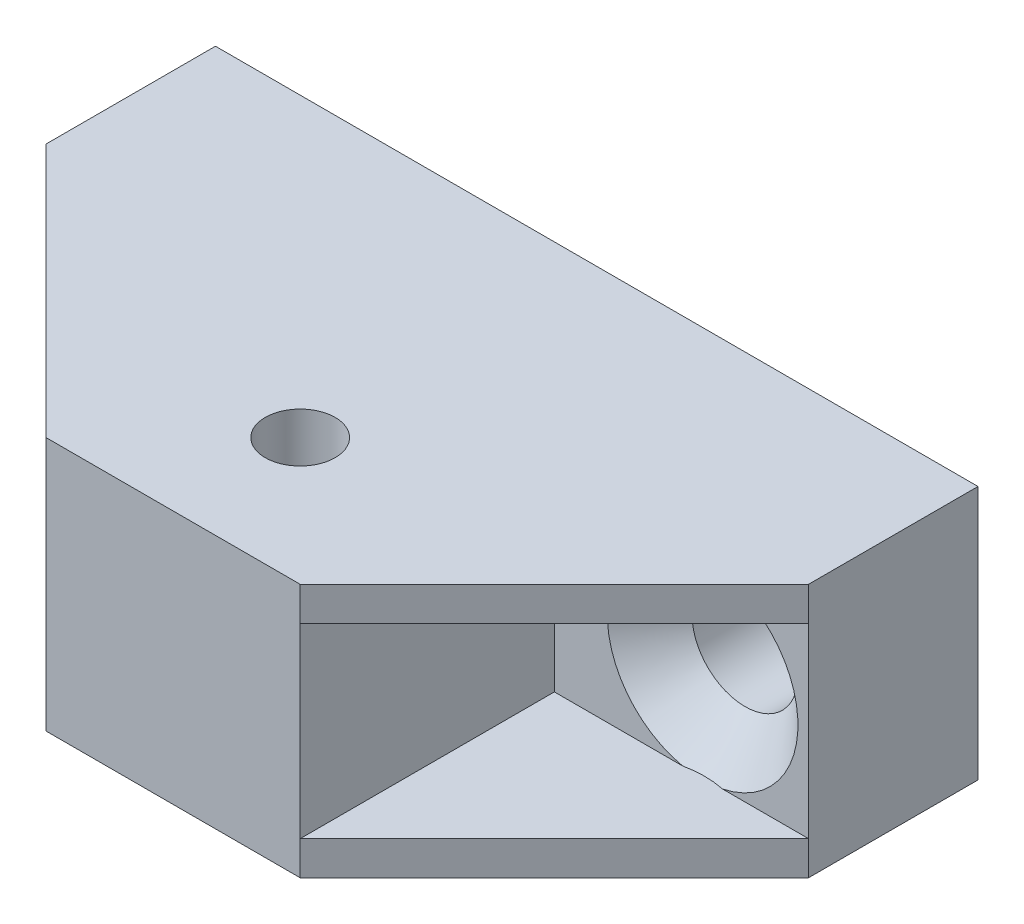
ISO-10303-21;
HEADER;
FILE_DESCRIPTION(('STEP AP214'),'2;1');
FILE_NAME('part.step','',(''),(''),'','','');
FILE_SCHEMA(('AUTOMOTIVE_DESIGN { 1 0 10303 214 1 1 1 1 }'));
ENDSEC;
DATA;
#1=APPLICATION_CONTEXT('core data for automotive mechanical design processes');
#2=APPLICATION_PROTOCOL_DEFINITION('international standard','automotive_design',2000,#1);
#3=PRODUCT_CONTEXT('',#1,'mechanical');
#4=PRODUCT('Part','Part','',(#3));
#5=PRODUCT_RELATED_PRODUCT_CATEGORY('part','',(#4));
#6=PRODUCT_DEFINITION_FORMATION('','',#4);
#7=PRODUCT_DEFINITION_CONTEXT('part definition',#1,'design');
#8=PRODUCT_DEFINITION('design','',#6,#7);
#9=PRODUCT_DEFINITION_SHAPE('','',#8);
#10=(LENGTH_UNIT() NAMED_UNIT(*) SI_UNIT(.MILLI.,.METRE.));
#11=(NAMED_UNIT(*) PLANE_ANGLE_UNIT() SI_UNIT($,.RADIAN.));
#12=(NAMED_UNIT(*) SI_UNIT($,.STERADIAN.) SOLID_ANGLE_UNIT());
#13=UNCERTAINTY_MEASURE_WITH_UNIT(LENGTH_MEASURE(1.E-05),#10,'distance_accuracy_value','');
#14=(GEOMETRIC_REPRESENTATION_CONTEXT(3) GLOBAL_UNCERTAINTY_ASSIGNED_CONTEXT((#13)) GLOBAL_UNIT_ASSIGNED_CONTEXT((#10,
#11,#12)) REPRESENTATION_CONTEXT('',''));
#15=CARTESIAN_POINT('',(0.,0.,0.));
#16=DIRECTION('',(0.,0.,1.));
#17=DIRECTION('',(1.,0.,0.));
#18=AXIS2_PLACEMENT_3D('',#15,#16,#17);
#19=CARTESIAN_POINT('',(0.,0.,8.));
#20=DIRECTION('',(0.,0.,-1.));
#21=DIRECTION('',(-1.,0.,0.));
#22=AXIS2_PLACEMENT_3D('',#19,#20,#21);
#23=PLANE('',#22);
#24=DIRECTION('',(1.,0.,0.));
#25=VECTOR('',#24,1.);
#26=CARTESIAN_POINT('',(12.,1.6,8.));
#27=LINE('',#26,#25);
#28=CARTESIAN_POINT('',(0.,1.6,8.));
#29=VERTEX_POINT('',#28);
#30=CARTESIAN_POINT('',(4.05660188679435,1.6,8.));
#31=VERTEX_POINT('',#30);
#32=EDGE_CURVE('E340',#29,#31,#27,.T.);
#33=ORIENTED_EDGE('',*,*,#32,.T.);
#34=CARTESIAN_POINT('',(5.,6.,8.));
#35=DIRECTION('',(0.,0.,-1.));
#36=DIRECTION('',(-1.,0.,0.));
#37=AXIS2_PLACEMENT_3D('',#34,#35,#36);
#38=CIRCLE('',#37,4.5);
#39=CARTESIAN_POINT('',(4.05660188679435,10.4,8.));
#40=VERTEX_POINT('',#39);
#41=EDGE_CURVE('E248',#31,#40,#38,.T.);
#42=ORIENTED_EDGE('',*,*,#41,.T.);
#43=DIRECTION('',(1.,0.,0.));
#44=VECTOR('',#43,1.);
#45=CARTESIAN_POINT('',(12.,10.4,8.));
#46=LINE('',#45,#44);
#47=CARTESIAN_POINT('',(0.,10.4,8.));
#48=VERTEX_POINT('',#47);
#49=EDGE_CURVE('E319',#48,#40,#46,.T.);
#50=ORIENTED_EDGE('',*,*,#49,.F.);
#51=DIRECTION('',(0.,-1.,0.));
#52=VECTOR('',#51,1.);
#53=CARTESIAN_POINT('',(0.,0.,8.));
#54=LINE('',#53,#52);
#55=EDGE_CURVE('E210',#48,#29,#54,.T.);
#56=ORIENTED_EDGE('',*,*,#55,.T.);
#57=EDGE_LOOP('',(#33,#42,#50,#56));
#58=FACE_BOUND('',#57,.T.);
#59=ADVANCED_FACE('F35',(#58),#23,.F.);
#60=DIRECTION('',(1.,0.,0.));
#61=VECTOR('',#60,1.);
#62=CARTESIAN_POINT('',(24.,1.6,8.));
#63=LINE('',#62,#61);
#64=CARTESIAN_POINT('',(24.,1.6,8.));
#65=VERTEX_POINT('',#64);
#66=CARTESIAN_POINT('',(30.0566018867944,1.6,8.));
#67=VERTEX_POINT('',#66);
#68=EDGE_CURVE('E294',#65,#67,#63,.T.);
#69=ORIENTED_EDGE('',*,*,#68,.T.);
#70=CARTESIAN_POINT('',(31.,6.,8.));
#71=DIRECTION('',(0.,0.,-1.));
#72=DIRECTION('',(-1.,0.,0.));
#73=AXIS2_PLACEMENT_3D('',#70,#71,#72);
#74=CIRCLE('',#73,4.49999999999998);
#75=CARTESIAN_POINT('',(30.0566018867944,10.4,8.));
#76=VERTEX_POINT('',#75);
#77=EDGE_CURVE('E241',#67,#76,#74,.T.);
#78=ORIENTED_EDGE('',*,*,#77,.T.);
#79=DIRECTION('',(1.,0.,0.));
#80=VECTOR('',#79,1.);
#81=CARTESIAN_POINT('',(24.,10.4,8.));
#82=LINE('',#81,#80);
#83=CARTESIAN_POINT('',(24.,10.4,8.));
#84=VERTEX_POINT('',#83);
#85=EDGE_CURVE('E303',#84,#76,#82,.T.);
#86=ORIENTED_EDGE('',*,*,#85,.F.);
#87=DIRECTION('',(0.,1.,0.));
#88=VECTOR('',#87,1.);
#89=CARTESIAN_POINT('',(24.,0.,8.));
#90=LINE('',#89,#88);
#91=EDGE_CURVE('E185',#65,#84,#90,.T.);
#92=ORIENTED_EDGE('',*,*,#91,.F.);
#93=EDGE_LOOP('',(#69,#78,#86,#92));
#94=FACE_BOUND('',#93,.T.);
#95=ADVANCED_FACE('F300',(#94),#23,.F.);
#96=CARTESIAN_POINT('',(5.94339811320565,10.4,8.));
#97=VERTEX_POINT('',#96);
#98=CARTESIAN_POINT('',(12.,10.4,8.));
#99=VERTEX_POINT('',#98);
#100=EDGE_CURVE('E318',#97,#99,#46,.T.);
#101=ORIENTED_EDGE('',*,*,#100,.F.);
#102=CARTESIAN_POINT('',(5.,6.,8.));
#103=DIRECTION('',(0.,0.,-1.));
#104=DIRECTION('',(-1.,0.,0.));
#105=AXIS2_PLACEMENT_3D('',#102,#103,#104);
#106=CIRCLE('',#105,4.5);
#107=CARTESIAN_POINT('',(5.94339811320565,1.6,8.));
#108=VERTEX_POINT('',#107);
#109=EDGE_CURVE('E57',#97,#108,#106,.T.);
#110=ORIENTED_EDGE('',*,*,#109,.T.);
#111=CARTESIAN_POINT('',(12.,1.6,8.));
#112=VERTEX_POINT('',#111);
#113=EDGE_CURVE('E339',#108,#112,#27,.T.);
#114=ORIENTED_EDGE('',*,*,#113,.T.);
#115=DIRECTION('',(0.,1.,0.));
#116=VECTOR('',#115,1.);
#117=CARTESIAN_POINT('',(12.,0.,8.));
#118=LINE('',#117,#116);
#119=EDGE_CURVE('E205',#112,#99,#118,.T.);
#120=ORIENTED_EDGE('',*,*,#119,.T.);
#121=EDGE_LOOP('',(#101,#110,#114,#120));
#122=FACE_BOUND('',#121,.T.);
#123=ADVANCED_FACE('F353',(#122),#23,.F.);
#124=CARTESIAN_POINT('',(12.,0.,8.));
#125=DIRECTION('',(-1.,0.,0.));
#126=DIRECTION('',(0.,0.,1.));
#127=AXIS2_PLACEMENT_3D('',#124,#125,#126);
#128=PLANE('',#127);
#129=DIRECTION('',(0.,1.,0.));
#130=VECTOR('',#129,1.);
#131=CARTESIAN_POINT('',(12.,0.,20.));
#132=LINE('',#131,#130);
#133=CARTESIAN_POINT('',(12.,1.6,20.));
#134=VERTEX_POINT('',#133);
#135=CARTESIAN_POINT('',(12.,10.4,20.));
#136=VERTEX_POINT('',#135);
#137=EDGE_CURVE('E193',#134,#136,#132,.T.);
#138=ORIENTED_EDGE('',*,*,#137,.T.);
#139=DIRECTION('',(0.,0.,1.));
#140=VECTOR('',#139,1.);
#141=CARTESIAN_POINT('',(12.,10.4,20.));
#142=LINE('',#141,#140);
#143=EDGE_CURVE('E312',#99,#136,#142,.T.);
#144=ORIENTED_EDGE('',*,*,#143,.F.);
#145=ORIENTED_EDGE('',*,*,#119,.F.);
#146=DIRECTION('',(0.,0.,1.));
#147=VECTOR('',#146,1.);
#148=CARTESIAN_POINT('',(12.,1.6,20.));
#149=LINE('',#148,#147);
#150=EDGE_CURVE('E333',#112,#134,#149,.T.);
#151=ORIENTED_EDGE('',*,*,#150,.T.);
#152=EDGE_LOOP('',(#138,#144,#145,#151));
#153=FACE_BOUND('',#152,.T.);
#154=ADVANCED_FACE('F358',(#153),#128,.T.);
#155=CARTESIAN_POINT('',(31.9433981132056,10.4,8.));
#156=VERTEX_POINT('',#155);
#157=CARTESIAN_POINT('',(36.,10.4,8.));
#158=VERTEX_POINT('',#157);
#159=EDGE_CURVE('E162',#156,#158,#82,.T.);
#160=ORIENTED_EDGE('',*,*,#159,.F.);
#161=CARTESIAN_POINT('',(31.,6.,8.));
#162=DIRECTION('',(0.,0.,-1.));
#163=DIRECTION('',(-1.,0.,0.));
#164=AXIS2_PLACEMENT_3D('',#161,#162,#163);
#165=CIRCLE('',#164,4.49999999999998);
#166=CARTESIAN_POINT('',(31.9433981132056,1.6,8.));
#167=VERTEX_POINT('',#166);
#168=EDGE_CURVE('E234',#156,#167,#165,.T.);
#169=ORIENTED_EDGE('',*,*,#168,.T.);
#170=CARTESIAN_POINT('',(36.,1.6,8.));
#171=VERTEX_POINT('',#170);
#172=EDGE_CURVE('E295',#167,#171,#63,.T.);
#173=ORIENTED_EDGE('',*,*,#172,.T.);
#174=DIRECTION('',(0.,1.,0.));
#175=VECTOR('',#174,1.);
#176=CARTESIAN_POINT('',(36.,0.,8.));
#177=LINE('',#176,#175);
#178=EDGE_CURVE('E209',#171,#158,#177,.T.);
#179=ORIENTED_EDGE('',*,*,#178,.T.);
#180=EDGE_LOOP('',(#160,#169,#173,#179));
#181=FACE_BOUND('',#180,.T.);
#182=ADVANCED_FACE('F306',(#181),#23,.F.);
#183=CARTESIAN_POINT('',(24.,0.,8.));
#184=DIRECTION('',(1.,0.,0.));
#185=DIRECTION('',(0.,0.,-1.));
#186=AXIS2_PLACEMENT_3D('',#183,#184,#185);
#187=PLANE('',#186);
#188=DIRECTION('',(0.,0.,-1.));
#189=VECTOR('',#188,1.);
#190=CARTESIAN_POINT('',(24.,10.4,20.));
#191=LINE('',#190,#189);
#192=CARTESIAN_POINT('',(24.,10.4,20.));
#193=VERTEX_POINT('',#192);
#194=EDGE_CURVE('E159',#193,#84,#191,.T.);
#195=ORIENTED_EDGE('',*,*,#194,.F.);
#196=DIRECTION('',(0.,1.,0.));
#197=VECTOR('',#196,1.);
#198=CARTESIAN_POINT('',(24.,0.,20.));
#199=LINE('',#198,#197);
#200=CARTESIAN_POINT('',(24.,1.6,20.));
#201=VERTEX_POINT('',#200);
#202=EDGE_CURVE('E182',#201,#193,#199,.T.);
#203=ORIENTED_EDGE('',*,*,#202,.F.);
#204=DIRECTION('',(0.,0.,-1.));
#205=VECTOR('',#204,1.);
#206=CARTESIAN_POINT('',(24.,1.6,20.));
#207=LINE('',#206,#205);
#208=EDGE_CURVE('E329',#201,#65,#207,.T.);
#209=ORIENTED_EDGE('',*,*,#208,.T.);
#210=ORIENTED_EDGE('',*,*,#91,.T.);
#211=EDGE_LOOP('',(#195,#203,#209,#210));
#212=FACE_BOUND('',#211,.T.);
#213=ADVANCED_FACE('F180',(#212),#187,.T.);
#214=CARTESIAN_POINT('',(0.,0.,8.));
#215=DIRECTION('',(1.,0.,0.));
#216=DIRECTION('',(0.,0.,-1.));
#217=AXIS2_PLACEMENT_3D('',#214,#215,#216);
#218=PLANE('',#217);
#219=DIRECTION('',(0.,-1.,0.));
#220=VECTOR('',#219,1.);
#221=CARTESIAN_POINT('',(0.,0.,0.));
#222=LINE('',#221,#220);
#223=CARTESIAN_POINT('',(0.,12.,0.));
#224=VERTEX_POINT('',#223);
#225=CARTESIAN_POINT('',(0.,0.,0.));
#226=VERTEX_POINT('',#225);
#227=EDGE_CURVE('E201',#224,#226,#222,.T.);
#228=ORIENTED_EDGE('',*,*,#227,.T.);
#229=DIRECTION('',(0.,0.,-1.));
#230=VECTOR('',#229,1.);
#231=CARTESIAN_POINT('',(0.,0.,8.));
#232=LINE('',#231,#230);
#233=CARTESIAN_POINT('',(0.,0.,8.));
#234=VERTEX_POINT('',#233);
#235=EDGE_CURVE('E231',#234,#226,#232,.T.);
#236=ORIENTED_EDGE('',*,*,#235,.F.);
#237=DIRECTION('',(0.,-1.,0.));
#238=VECTOR('',#237,1.);
#239=CARTESIAN_POINT('',(0.,1.6,8.));
#240=LINE('',#239,#238);
#241=EDGE_CURVE('E342',#29,#234,#240,.T.);
#242=ORIENTED_EDGE('',*,*,#241,.F.);
#243=ORIENTED_EDGE('',*,*,#55,.F.);
#244=CARTESIAN_POINT('',(0.,12.,8.));
#245=VERTEX_POINT('',#244);
#246=EDGE_CURVE('E206',#245,#48,#54,.T.);
#247=ORIENTED_EDGE('',*,*,#246,.F.);
#248=DIRECTION('',(0.,0.,-1.));
#249=VECTOR('',#248,1.);
#250=CARTESIAN_POINT('',(0.,12.,8.));
#251=LINE('',#250,#249);
#252=EDGE_CURVE('E214',#245,#224,#251,.T.);
#253=ORIENTED_EDGE('',*,*,#252,.T.);
#254=EDGE_LOOP('',(#228,#236,#242,#243,#247,#253));
#255=FACE_BOUND('',#254,.T.);
#256=ADVANCED_FACE('F388',(#255),#218,.F.);
#257=CARTESIAN_POINT('',(0.,0.,8.));
#258=DIRECTION('',(0.,1.,0.));
#259=DIRECTION('',(0.,0.,1.));
#260=AXIS2_PLACEMENT_3D('',#257,#258,#259);
#261=PLANE('',#260);
#262=DIRECTION('',(0.,0.,-1.));
#263=VECTOR('',#262,1.);
#264=CARTESIAN_POINT('',(36.,0.,8.));
#265=LINE('',#264,#263);
#266=CARTESIAN_POINT('',(36.,0.,8.));
#267=VERTEX_POINT('',#266);
#268=CARTESIAN_POINT('',(36.,0.,0.));
#269=VERTEX_POINT('',#268);
#270=EDGE_CURVE('E228',#267,#269,#265,.T.);
#271=ORIENTED_EDGE('',*,*,#270,.F.);
#272=DIRECTION('',(-0.707106781186547,0.,0.707106781186548));
#273=VECTOR('',#272,1.);
#274=CARTESIAN_POINT('',(36.,0.,8.));
#275=LINE('',#274,#273);
#276=CARTESIAN_POINT('',(24.,0.,20.));
#277=VERTEX_POINT('',#276);
#278=EDGE_CURVE('E326',#267,#277,#275,.T.);
#279=ORIENTED_EDGE('',*,*,#278,.T.);
#280=DIRECTION('',(1.,0.,0.));
#281=VECTOR('',#280,1.);
#282=CARTESIAN_POINT('',(12.,0.,20.));
#283=LINE('',#282,#281);
#284=CARTESIAN_POINT('',(12.,0.,20.));
#285=VERTEX_POINT('',#284);
#286=EDGE_CURVE('E349',#285,#277,#283,.T.);
#287=ORIENTED_EDGE('',*,*,#286,.F.);
#288=DIRECTION('',(-0.707106781186547,0.,-0.707106781186548));
#289=VECTOR('',#288,1.);
#290=CARTESIAN_POINT('',(0.,0.,8.));
#291=LINE('',#290,#289);
#292=EDGE_CURVE('E301',#285,#234,#291,.T.);
#293=ORIENTED_EDGE('',*,*,#292,.T.);
#294=ORIENTED_EDGE('',*,*,#235,.T.);
#295=DIRECTION('',(1.,0.,0.));
#296=VECTOR('',#295,1.);
#297=CARTESIAN_POINT('',(0.,0.,0.));
#298=LINE('',#297,#296);
#299=EDGE_CURVE('E217',#226,#269,#298,.T.);
#300=ORIENTED_EDGE('',*,*,#299,.T.);
#301=EDGE_LOOP('',(#271,#279,#287,#293,#294,#300));
#302=FACE_BOUND('',#301,.T.);
#303=CARTESIAN_POINT('',(18.,0.,14.));
#304=DIRECTION('',(0.,1.,0.));
#305=DIRECTION('',(0.,0.,1.));
#306=AXIS2_PLACEMENT_3D('',#303,#304,#305);
#307=CIRCLE('',#306,1.65);
#308=CARTESIAN_POINT('',(18.,0.,15.65));
#309=VERTEX_POINT('',#308);
#310=EDGE_CURVE('E239',#309,#309,#307,.T.);
#311=ORIENTED_EDGE('',*,*,#310,.T.);
#312=EDGE_LOOP('',(#311));
#313=FACE_BOUND('',#312,.T.);
#314=ADVANCED_FACE('F368',(#302,#313),#261,.F.);
#315=CARTESIAN_POINT('',(36.,0.,8.));
#316=DIRECTION('',(-1.,0.,0.));
#317=DIRECTION('',(0.,0.,1.));
#318=AXIS2_PLACEMENT_3D('',#315,#316,#317);
#319=PLANE('',#318);
#320=DIRECTION('',(0.,1.,0.));
#321=VECTOR('',#320,1.);
#322=CARTESIAN_POINT('',(36.,0.,0.));
#323=LINE('',#322,#321);
#324=CARTESIAN_POINT('',(36.,12.,0.));
#325=VERTEX_POINT('',#324);
#326=EDGE_CURVE('E219',#269,#325,#323,.T.);
#327=ORIENTED_EDGE('',*,*,#326,.T.);
#328=DIRECTION('',(0.,0.,-1.));
#329=VECTOR('',#328,1.);
#330=CARTESIAN_POINT('',(36.,12.,8.));
#331=LINE('',#330,#329);
#332=CARTESIAN_POINT('',(36.,12.,8.));
#333=VERTEX_POINT('',#332);
#334=EDGE_CURVE('E225',#333,#325,#331,.T.);
#335=ORIENTED_EDGE('',*,*,#334,.F.);
#336=DIRECTION('',(0.,1.,0.));
#337=VECTOR('',#336,1.);
#338=CARTESIAN_POINT('',(36.,10.4,8.));
#339=LINE('',#338,#337);
#340=EDGE_CURVE('E175',#158,#333,#339,.T.);
#341=ORIENTED_EDGE('',*,*,#340,.F.);
#342=ORIENTED_EDGE('',*,*,#178,.F.);
#343=EDGE_CURVE('E211',#267,#171,#177,.T.);
#344=ORIENTED_EDGE('',*,*,#343,.F.);
#345=ORIENTED_EDGE('',*,*,#270,.T.);
#346=EDGE_LOOP('',(#327,#335,#341,#342,#344,#345));
#347=FACE_BOUND('',#346,.T.);
#348=ADVANCED_FACE('F374',(#347),#319,.F.);
#349=CARTESIAN_POINT('',(0.,12.,8.));
#350=DIRECTION('',(0.,-1.,0.));
#351=DIRECTION('',(0.,0.,-1.));
#352=AXIS2_PLACEMENT_3D('',#349,#350,#351);
#353=PLANE('',#352);
#354=ORIENTED_EDGE('',*,*,#252,.F.);
#355=DIRECTION('',(-0.707106781186547,0.,-0.707106781186548));
#356=VECTOR('',#355,1.);
#357=CARTESIAN_POINT('',(0.,12.,8.));
#358=LINE('',#357,#356);
#359=CARTESIAN_POINT('',(12.,12.,20.));
#360=VERTEX_POINT('',#359);
#361=EDGE_CURVE('E174',#360,#245,#358,.T.);
#362=ORIENTED_EDGE('',*,*,#361,.F.);
#363=DIRECTION('',(1.,0.,0.));
#364=VECTOR('',#363,1.);
#365=CARTESIAN_POINT('',(12.,12.,20.));
#366=LINE('',#365,#364);
#367=CARTESIAN_POINT('',(24.,12.,20.));
#368=VERTEX_POINT('',#367);
#369=EDGE_CURVE('E238',#360,#368,#366,.T.);
#370=ORIENTED_EDGE('',*,*,#369,.T.);
#371=DIRECTION('',(-0.707106781186547,0.,0.707106781186548));
#372=VECTOR('',#371,1.);
#373=CARTESIAN_POINT('',(36.,12.,8.));
#374=LINE('',#373,#372);
#375=EDGE_CURVE('E165',#333,#368,#374,.T.);
#376=ORIENTED_EDGE('',*,*,#375,.F.);
#377=ORIENTED_EDGE('',*,*,#334,.T.);
#378=DIRECTION('',(-1.,0.,0.));
#379=VECTOR('',#378,1.);
#380=CARTESIAN_POINT('',(0.,12.,0.));
#381=LINE('',#380,#379);
#382=EDGE_CURVE('E221',#325,#224,#381,.T.);
#383=ORIENTED_EDGE('',*,*,#382,.T.);
#384=EDGE_LOOP('',(#354,#362,#370,#376,#377,#383));
#385=FACE_BOUND('',#384,.T.);
#386=CARTESIAN_POINT('',(18.,12.,14.));
#387=DIRECTION('',(0.,-1.,0.));
#388=DIRECTION('',(0.,0.,-1.));
#389=AXIS2_PLACEMENT_3D('',#386,#387,#388);
#390=CIRCLE('',#389,1.65);
#391=CARTESIAN_POINT('',(18.,12.,12.35));
#392=VERTEX_POINT('',#391);
#393=EDGE_CURVE('E235',#392,#392,#390,.T.);
#394=ORIENTED_EDGE('',*,*,#393,.T.);
#395=EDGE_LOOP('',(#394));
#396=FACE_BOUND('',#395,.T.);
#397=ADVANCED_FACE('F377',(#385,#396),#353,.F.);
#398=CARTESIAN_POINT('',(0.,0.,0.));
#399=DIRECTION('',(0.,0.,-1.));
#400=DIRECTION('',(-1.,0.,0.));
#401=AXIS2_PLACEMENT_3D('',#398,#399,#400);
#402=PLANE('',#401);
#403=CARTESIAN_POINT('',(5.,6.,0.));
#404=DIRECTION('',(0.,0.,1.));
#405=DIRECTION('',(1.,0.,0.));
#406=AXIS2_PLACEMENT_3D('',#403,#404,#405);
#407=CIRCLE('',#406,2.5);
#408=CARTESIAN_POINT('',(7.5,6.,0.));
#409=VERTEX_POINT('',#408);
#410=EDGE_CURVE('E198',#409,#409,#407,.T.);
#411=ORIENTED_EDGE('',*,*,#410,.T.);
#412=EDGE_LOOP('',(#411));
#413=FACE_BOUND('',#412,.T.);
#414=CARTESIAN_POINT('',(31.,6.,0.));
#415=DIRECTION('',(0.,0.,1.));
#416=DIRECTION('',(-1.,0.,0.));
#417=AXIS2_PLACEMENT_3D('',#414,#415,#416);
#418=CIRCLE('',#417,2.49999999999999);
#419=CARTESIAN_POINT('',(28.5,6.,0.));
#420=VERTEX_POINT('',#419);
#421=EDGE_CURVE('E202',#420,#420,#418,.T.);
#422=ORIENTED_EDGE('',*,*,#421,.T.);
#423=EDGE_LOOP('',(#422));
#424=FACE_BOUND('',#423,.T.);
#425=ORIENTED_EDGE('',*,*,#227,.F.);
#426=ORIENTED_EDGE('',*,*,#382,.F.);
#427=ORIENTED_EDGE('',*,*,#326,.F.);
#428=ORIENTED_EDGE('',*,*,#299,.F.);
#429=EDGE_LOOP('',(#425,#426,#427,#428));
#430=FACE_BOUND('',#429,.T.);
#431=ADVANCED_FACE('F392',(#413,#424,#430),#402,.T.);
#432=CARTESIAN_POINT('',(31.,6.,0.));
#433=DIRECTION('',(0.,0.,1.));
#434=DIRECTION('',(1.,0.,0.));
#435=AXIS2_PLACEMENT_3D('',#432,#433,#434);
#436=CYLINDRICAL_SURFACE('',#435,2.49999999999999);
#437=CARTESIAN_POINT('',(31.,6.,6.));
#438=DIRECTION('',(0.,0.,-1.));
#439=DIRECTION('',(-1.,0.,0.));
#440=AXIS2_PLACEMENT_3D('',#437,#438,#439);
#441=CIRCLE('',#440,2.49999999999999);
#442=CARTESIAN_POINT('',(28.5,6.,6.));
#443=VERTEX_POINT('',#442);
#444=EDGE_CURVE('E244',#443,#443,#441,.F.);
#445=ORIENTED_EDGE('',*,*,#444,.T.);
#446=EDGE_LOOP('',(#445));
#447=FACE_BOUND('',#446,.T.);
#448=ORIENTED_EDGE('',*,*,#421,.F.);
#449=EDGE_LOOP('',(#448));
#450=FACE_BOUND('',#449,.T.);
#451=ADVANCED_FACE('F394',(#447,#450),#436,.F.);
#452=CARTESIAN_POINT('',(5.,6.,0.));
#453=DIRECTION('',(0.,0.,1.));
#454=DIRECTION('',(1.,0.,0.));
#455=AXIS2_PLACEMENT_3D('',#452,#453,#454);
#456=CYLINDRICAL_SURFACE('',#455,2.5);
#457=CARTESIAN_POINT('',(5.,6.,5.99999999999999));
#458=DIRECTION('',(0.,0.,-1.));
#459=DIRECTION('',(-1.,0.,0.));
#460=AXIS2_PLACEMENT_3D('',#457,#458,#459);
#461=CIRCLE('',#460,2.5);
#462=CARTESIAN_POINT('',(2.5,6.,5.99999999999999));
#463=VERTEX_POINT('',#462);
#464=EDGE_CURVE('E251',#463,#463,#461,.F.);
#465=ORIENTED_EDGE('',*,*,#464,.T.);
#466=EDGE_LOOP('',(#465));
#467=FACE_BOUND('',#466,.T.);
#468=ORIENTED_EDGE('',*,*,#410,.F.);
#469=EDGE_LOOP('',(#468));
#470=FACE_BOUND('',#469,.T.);
#471=ADVANCED_FACE('F401',(#467,#470),#456,.F.);
#472=CARTESIAN_POINT('',(12.,0.,20.));
#473=DIRECTION('',(0.,0.,1.));
#474=DIRECTION('',(1.,0.,0.));
#475=AXIS2_PLACEMENT_3D('',#472,#473,#474);
#476=PLANE('',#475);
#477=ORIENTED_EDGE('',*,*,#369,.F.);
#478=DIRECTION('',(0.,1.,0.));
#479=VECTOR('',#478,1.);
#480=CARTESIAN_POINT('',(12.,10.4,20.));
#481=LINE('',#480,#479);
#482=EDGE_CURVE('E321',#136,#360,#481,.T.);
#483=ORIENTED_EDGE('',*,*,#482,.F.);
#484=ORIENTED_EDGE('',*,*,#137,.F.);
#485=EDGE_CURVE('E190',#285,#134,#132,.T.);
#486=ORIENTED_EDGE('',*,*,#485,.F.);
#487=ORIENTED_EDGE('',*,*,#286,.T.);
#488=EDGE_CURVE('E189',#277,#201,#199,.T.);
#489=ORIENTED_EDGE('',*,*,#488,.T.);
#490=ORIENTED_EDGE('',*,*,#202,.T.);
#491=DIRECTION('',(0.,1.,0.));
#492=VECTOR('',#491,1.);
#493=CARTESIAN_POINT('',(24.,10.4,20.));
#494=LINE('',#493,#492);
#495=EDGE_CURVE('E168',#193,#368,#494,.T.);
#496=ORIENTED_EDGE('',*,*,#495,.T.);
#497=EDGE_LOOP('',(#477,#483,#484,#486,#487,#489,#490,#496));
#498=FACE_BOUND('',#497,.T.);
#499=ADVANCED_FACE('F187',(#498),#476,.T.);
#500=CARTESIAN_POINT('',(18.,0.,14.));
#501=DIRECTION('',(0.,1.,0.));
#502=DIRECTION('',(0.,0.,1.));
#503=AXIS2_PLACEMENT_3D('',#500,#501,#502);
#504=CYLINDRICAL_SURFACE('',#503,1.65);
#505=ORIENTED_EDGE('',*,*,#310,.F.);
#506=EDGE_LOOP('',(#505));
#507=FACE_BOUND('',#506,.T.);
#508=ORIENTED_EDGE('',*,*,#393,.F.);
#509=EDGE_LOOP('',(#508));
#510=FACE_BOUND('',#509,.T.);
#511=ADVANCED_FACE('F426',(#507,#510),#504,.F.);
#512=CARTESIAN_POINT('',(0.,1.6,8.));
#513=DIRECTION('',(-0.707106781186548,0.,0.707106781186548));
#514=DIRECTION('',(0.707106781186548,0.,0.707106781186548));
#515=AXIS2_PLACEMENT_3D('',#512,#513,#514);
#516=PLANE('',#515);
#517=ORIENTED_EDGE('',*,*,#292,.F.);
#518=ORIENTED_EDGE('',*,*,#485,.T.);
#519=DIRECTION('',(-0.707106781186547,0.,-0.707106781186548));
#520=VECTOR('',#519,1.);
#521=CARTESIAN_POINT('',(0.,1.6,8.));
#522=LINE('',#521,#520);
#523=EDGE_CURVE('E336',#134,#29,#522,.T.);
#524=ORIENTED_EDGE('',*,*,#523,.T.);
#525=ORIENTED_EDGE('',*,*,#241,.T.);
#526=EDGE_LOOP('',(#517,#518,#524,#525));
#527=FACE_BOUND('',#526,.T.);
#528=ADVANCED_FACE('F363',(#527),#516,.T.);
#529=CARTESIAN_POINT('',(0.,1.6,0.));
#530=DIRECTION('',(0.,1.,0.));
#531=DIRECTION('',(0.,0.,1.));
#532=AXIS2_PLACEMENT_3D('',#529,#530,#531);
#533=PLANE('',#532);
#534=ORIENTED_EDGE('',*,*,#150,.F.);
#535=ORIENTED_EDGE('',*,*,#113,.F.);
#536=CARTESIAN_POINT('',(5.94339811320565,1.6,8.));
#537=CARTESIAN_POINT('',(5.83359450762683,1.6,7.97693232826158));
#538=CARTESIAN_POINT('',(5.72296487687723,1.6,7.95762656917826));
#539=CARTESIAN_POINT('',(5.50055280795741,1.6,7.92702286816681));
#540=CARTESIAN_POINT('',(5.38876982781334,1.6,7.91572888284725));
#541=CARTESIAN_POINT('',(5.16636862697427,1.6,7.90176376495504));
#542=CARTESIAN_POINT('',(5.05575864049396,1.6,7.89896375945088));
#543=CARTESIAN_POINT('',(4.83469390010924,1.6,7.90171806855617));
#544=CARTESIAN_POINT('',(4.72423909745673,1.6,7.90726842064796));
#545=CARTESIAN_POINT('',(4.52080330320934,1.6,7.92504057480302));
#546=CARTESIAN_POINT('',(4.42771937787119,1.6,7.93611949084911));
#547=CARTESIAN_POINT('',(4.24176475351793,1.6,7.96389576074271));
#548=CARTESIAN_POINT('',(4.14889948237872,1.6,7.98062958386276));
#549=CARTESIAN_POINT('',(4.05660188679435,1.6,8.));
#550=B_SPLINE_CURVE_WITH_KNOTS('',3,(#536,#537,#538,#539,#540,#541,#542,#543,#544,#545,#546,
#547,#548,#549),.UNSPECIFIED.,.F.,.F.,(4,2,2,2,2,2,4),(0.,0.336589383646868,0.673344876210967,
1.00496480746203,1.33642742384174,1.61748431608187,1.90038951649221),.UNSPECIFIED.);
#551=EDGE_CURVE('E11',#108,#31,#550,.T.);
#552=ORIENTED_EDGE('',*,*,#551,.T.);
#553=ORIENTED_EDGE('',*,*,#32,.F.);
#554=ORIENTED_EDGE('',*,*,#523,.F.);
#555=EDGE_LOOP('',(#534,#535,#552,#553,#554));
#556=FACE_BOUND('',#555,.T.);
#557=ADVANCED_FACE('F360',(#556),#533,.T.);
#558=CARTESIAN_POINT('',(36.,1.6,8.));
#559=DIRECTION('',(0.707106781186548,0.,0.707106781186547));
#560=DIRECTION('',(0.707106781186547,0.,-0.707106781186548));
#561=AXIS2_PLACEMENT_3D('',#558,#559,#560);
#562=PLANE('',#561);
#563=ORIENTED_EDGE('',*,*,#278,.F.);
#564=ORIENTED_EDGE('',*,*,#343,.T.);
#565=DIRECTION('',(-0.707106781186547,0.,0.707106781186548));
#566=VECTOR('',#565,1.);
#567=CARTESIAN_POINT('',(36.,1.6,8.));
#568=LINE('',#567,#566);
#569=EDGE_CURVE('E327',#171,#201,#568,.T.);
#570=ORIENTED_EDGE('',*,*,#569,.T.);
#571=ORIENTED_EDGE('',*,*,#488,.F.);
#572=EDGE_LOOP('',(#563,#564,#570,#571));
#573=FACE_BOUND('',#572,.T.);
#574=ADVANCED_FACE('F372',(#573),#562,.T.);
#575=CARTESIAN_POINT('',(0.,1.6,0.));
#576=DIRECTION('',(0.,-1.,0.));
#577=DIRECTION('',(0.,0.,-1.));
#578=AXIS2_PLACEMENT_3D('',#575,#576,#577);
#579=PLANE('',#578);
#580=ORIENTED_EDGE('',*,*,#569,.F.);
#581=ORIENTED_EDGE('',*,*,#172,.F.);
#582=CARTESIAN_POINT('',(31.9433981132056,1.6,8.));
#583=CARTESIAN_POINT('',(31.8335945076268,1.6,7.97693232826159));
#584=CARTESIAN_POINT('',(31.7229648768772,1.6,7.95762656917827));
#585=CARTESIAN_POINT('',(31.5005528079573,1.6,7.92702286816681));
#586=CARTESIAN_POINT('',(31.3887698278133,1.6,7.91572888284726));
#587=CARTESIAN_POINT('',(31.1663686269742,1.6,7.90176376495505));
#588=CARTESIAN_POINT('',(31.0557586404939,1.6,7.89896375945089));
#589=CARTESIAN_POINT('',(30.8346939001092,1.6,7.90171806855619));
#590=CARTESIAN_POINT('',(30.7242390974567,1.6,7.90726842064798));
#591=CARTESIAN_POINT('',(30.5208033032093,1.6,7.92504057480304));
#592=CARTESIAN_POINT('',(30.4277193778712,1.6,7.93611949084913));
#593=CARTESIAN_POINT('',(30.241764753518,1.6,7.96389576074272));
#594=CARTESIAN_POINT('',(30.1488994823788,1.6,7.98062958386276));
#595=CARTESIAN_POINT('',(30.0566018867944,1.6,8.));
#596=B_SPLINE_CURVE_WITH_KNOTS('',3,(#582,#583,#584,#585,#586,#587,#588,#589,#590,#591,#592,
#593,#594,#595),.UNSPECIFIED.,.F.,.F.,(4,2,2,2,2,2,4),(0.,0.336589383646864,0.673344876210966,
1.00496480746202,1.33642742384174,1.6174843160818,1.90038951649208),.UNSPECIFIED.);
#597=EDGE_CURVE('E261',#167,#67,#596,.T.);
#598=ORIENTED_EDGE('',*,*,#597,.T.);
#599=ORIENTED_EDGE('',*,*,#68,.F.);
#600=ORIENTED_EDGE('',*,*,#208,.F.);
#601=EDGE_LOOP('',(#580,#581,#598,#599,#600));
#602=FACE_BOUND('',#601,.T.);
#603=ADVANCED_FACE('F292',(#602),#579,.F.);
#604=CARTESIAN_POINT('',(0.,10.4,8.));
#605=DIRECTION('',(0.707106781186548,0.,-0.707106781186548));
#606=DIRECTION('',(-0.707106781186548,0.,-0.707106781186548));
#607=AXIS2_PLACEMENT_3D('',#604,#605,#606);
#608=PLANE('',#607);
#609=ORIENTED_EDGE('',*,*,#361,.T.);
#610=ORIENTED_EDGE('',*,*,#246,.T.);
#611=DIRECTION('',(-0.707106781186547,0.,-0.707106781186548));
#612=VECTOR('',#611,1.);
#613=CARTESIAN_POINT('',(0.,10.4,8.));
#614=LINE('',#613,#612);
#615=EDGE_CURVE('E315',#136,#48,#614,.T.);
#616=ORIENTED_EDGE('',*,*,#615,.F.);
#617=ORIENTED_EDGE('',*,*,#482,.T.);
#618=EDGE_LOOP('',(#609,#610,#616,#617));
#619=FACE_BOUND('',#618,.T.);
#620=ADVANCED_FACE('F280',(#619),#608,.F.);
#621=CARTESIAN_POINT('',(0.,10.4,0.));
#622=DIRECTION('',(0.,1.,0.));
#623=DIRECTION('',(0.,0.,1.));
#624=AXIS2_PLACEMENT_3D('',#621,#622,#623);
#625=PLANE('',#624);
#626=ORIENTED_EDGE('',*,*,#143,.T.);
#627=ORIENTED_EDGE('',*,*,#615,.T.);
#628=ORIENTED_EDGE('',*,*,#49,.T.);
#629=CARTESIAN_POINT('',(4.05660188679435,10.4,8.));
#630=CARTESIAN_POINT('',(4.16640549237316,10.4,7.97693232826159));
#631=CARTESIAN_POINT('',(4.27703512312277,10.4,7.95762656917826));
#632=CARTESIAN_POINT('',(4.49944719204259,10.4,7.92702286816681));
#633=CARTESIAN_POINT('',(4.61123017218666,10.4,7.91572888284725));
#634=CARTESIAN_POINT('',(4.83363137302572,10.4,7.90176376495504));
#635=CARTESIAN_POINT('',(4.94424135950604,10.4,7.89896375945088));
#636=CARTESIAN_POINT('',(5.16530609989075,10.4,7.90171806855617));
#637=CARTESIAN_POINT('',(5.27576090254326,10.4,7.90726842064796));
#638=CARTESIAN_POINT('',(5.47919669679066,10.4,7.92504057480302));
#639=CARTESIAN_POINT('',(5.57228062212881,10.4,7.93611949084911));
#640=CARTESIAN_POINT('',(5.75823524648207,10.4,7.96389576074271));
#641=CARTESIAN_POINT('',(5.85110051762128,10.4,7.98062958386276));
#642=CARTESIAN_POINT('',(5.94339811320565,10.4,8.));
#643=B_SPLINE_CURVE_WITH_KNOTS('',3,(#629,#630,#631,#632,#633,#634,#635,#636,#637,#638,#639,
#640,#641,#642),.UNSPECIFIED.,.F.,.F.,(4,2,2,2,2,2,4),(0.,0.336589383646868,0.673344876210966,
1.00496480746203,1.33642742384174,1.61748431608188,1.90038951649222),.UNSPECIFIED.);
#644=EDGE_CURVE('E50',#40,#97,#643,.T.);
#645=ORIENTED_EDGE('',*,*,#644,.T.);
#646=ORIENTED_EDGE('',*,*,#100,.T.);
#647=EDGE_LOOP('',(#626,#627,#628,#645,#646));
#648=FACE_BOUND('',#647,.T.);
#649=ADVANCED_FACE('F276',(#648),#625,.F.);
#650=CARTESIAN_POINT('',(36.,10.4,8.));
#651=DIRECTION('',(-0.707106781186548,0.,-0.707106781186547));
#652=DIRECTION('',(-0.707106781186547,0.,0.707106781186548));
#653=AXIS2_PLACEMENT_3D('',#650,#651,#652);
#654=PLANE('',#653);
#655=ORIENTED_EDGE('',*,*,#375,.T.);
#656=ORIENTED_EDGE('',*,*,#495,.F.);
#657=DIRECTION('',(-0.707106781186547,0.,0.707106781186548));
#658=VECTOR('',#657,1.);
#659=CARTESIAN_POINT('',(36.,10.4,8.));
#660=LINE('',#659,#658);
#661=EDGE_CURVE('E154',#158,#193,#660,.T.);
#662=ORIENTED_EDGE('',*,*,#661,.F.);
#663=ORIENTED_EDGE('',*,*,#340,.T.);
#664=EDGE_LOOP('',(#655,#656,#662,#663));
#665=FACE_BOUND('',#664,.T.);
#666=ADVANCED_FACE('F169',(#665),#654,.F.);
#667=CARTESIAN_POINT('',(0.,10.4,0.));
#668=DIRECTION('',(0.,-1.,0.));
#669=DIRECTION('',(0.,0.,-1.));
#670=AXIS2_PLACEMENT_3D('',#667,#668,#669);
#671=PLANE('',#670);
#672=ORIENTED_EDGE('',*,*,#661,.T.);
#673=ORIENTED_EDGE('',*,*,#194,.T.);
#674=ORIENTED_EDGE('',*,*,#85,.T.);
#675=CARTESIAN_POINT('',(30.0566018867944,10.4,8.));
#676=CARTESIAN_POINT('',(30.1664054923732,10.4,7.97693232826159));
#677=CARTESIAN_POINT('',(30.2770351231228,10.4,7.95762656917827));
#678=CARTESIAN_POINT('',(30.4994471920427,10.4,7.92702286816681));
#679=CARTESIAN_POINT('',(30.6112301721867,10.4,7.91572888284726));
#680=CARTESIAN_POINT('',(30.8336313730258,10.4,7.90176376495505));
#681=CARTESIAN_POINT('',(30.9442413595061,10.4,7.89896375945089));
#682=CARTESIAN_POINT('',(31.1653060998908,10.4,7.90171806855619));
#683=CARTESIAN_POINT('',(31.2757609025433,10.4,7.90726842064798));
#684=CARTESIAN_POINT('',(31.4791966967907,10.4,7.92504057480304));
#685=CARTESIAN_POINT('',(31.5722806221288,10.4,7.93611949084913));
#686=CARTESIAN_POINT('',(31.758235246482,10.4,7.96389576074272));
#687=CARTESIAN_POINT('',(31.8511005176212,10.4,7.98062958386276));
#688=CARTESIAN_POINT('',(31.9433981132056,10.4,8.));
#689=B_SPLINE_CURVE_WITH_KNOTS('',3,(#675,#676,#677,#678,#679,#680,#681,#682,#683,#684,#685,
#686,#687,#688),.UNSPECIFIED.,.F.,.F.,(4,2,2,2,2,2,4),(0.,0.336589383646867,0.673344876210966,
1.00496480746203,1.33642742384174,1.61748431608181,1.90038951649208),.UNSPECIFIED.);
#690=EDGE_CURVE('E254',#76,#156,#689,.T.);
#691=ORIENTED_EDGE('',*,*,#690,.T.);
#692=ORIENTED_EDGE('',*,*,#159,.T.);
#693=EDGE_LOOP('',(#672,#673,#674,#691,#692));
#694=FACE_BOUND('',#693,.T.);
#695=ADVANCED_FACE('F156',(#694),#671,.T.);
#696=CARTESIAN_POINT('',(31.,6.,8.));
#697=DIRECTION('',(0.,0.,1.));
#698=DIRECTION('',(1.,0.,0.));
#699=AXIS2_PLACEMENT_3D('',#696,#697,#698);
#700=CONICAL_SURFACE('',#699,4.49999999999998,0.785398163397445);
#701=ORIENTED_EDGE('',*,*,#444,.F.);
#702=EDGE_LOOP('',(#701));
#703=FACE_BOUND('',#702,.T.);
#704=ORIENTED_EDGE('',*,*,#690,.F.);
#705=ORIENTED_EDGE('',*,*,#77,.F.);
#706=ORIENTED_EDGE('',*,*,#597,.F.);
#707=ORIENTED_EDGE('',*,*,#168,.F.);
#708=EDGE_LOOP('',(#704,#705,#706,#707));
#709=FACE_BOUND('',#708,.T.);
#710=ADVANCED_FACE('F268',(#703,#709),#700,.F.);
#711=CARTESIAN_POINT('',(5.,6.,8.));
#712=DIRECTION('',(0.,0.,1.));
#713=DIRECTION('',(1.,0.,0.));
#714=AXIS2_PLACEMENT_3D('',#711,#712,#713);
#715=CONICAL_SURFACE('',#714,4.5,0.785398163397446);
#716=ORIENTED_EDGE('',*,*,#464,.F.);
#717=EDGE_LOOP('',(#716));
#718=FACE_BOUND('',#717,.T.);
#719=ORIENTED_EDGE('',*,*,#644,.F.);
#720=ORIENTED_EDGE('',*,*,#41,.F.);
#721=ORIENTED_EDGE('',*,*,#551,.F.);
#722=ORIENTED_EDGE('',*,*,#109,.F.);
#723=EDGE_LOOP('',(#719,#720,#721,#722));
#724=FACE_BOUND('',#723,.T.);
#725=ADVANCED_FACE('F38',(#718,#724),#715,.F.);
#726=CLOSED_SHELL('',(#59,#95,#123,#154,#182,#213,#256,#314,#348,#397,#431,#451,#471,#499,#511,
#528,#557,#574,#603,#620,#649,#666,#695,#710,#725));
#727=MANIFOLD_SOLID_BREP('B2',#726);
#728=ADVANCED_BREP_SHAPE_REPRESENTATION('',(#18,#727),#14);
#729=SHAPE_DEFINITION_REPRESENTATION(#9,#728);
ENDSEC;
END-ISO-10303-21;
